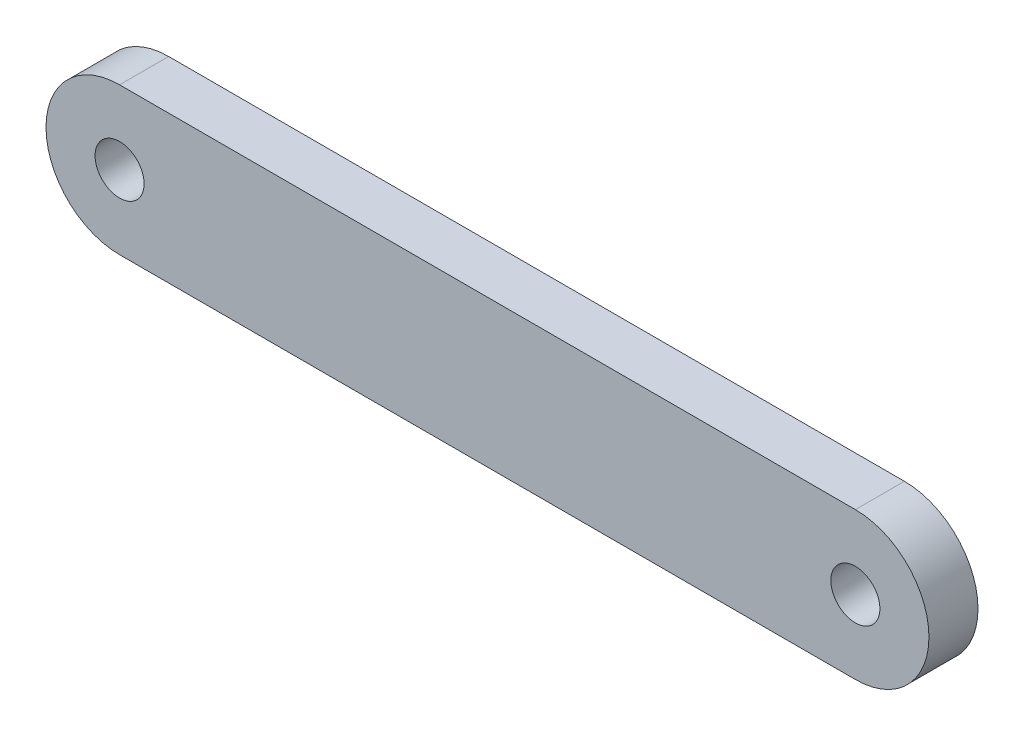
ISO-10303-21;
HEADER;
FILE_DESCRIPTION(('STEP AP214'),'2;1');
FILE_NAME('part.step','',(''),(''),'','','');
FILE_SCHEMA(('AUTOMOTIVE_DESIGN { 1 0 10303 214 1 1 1 1 }'));
ENDSEC;
DATA;
#1=APPLICATION_CONTEXT('core data for automotive mechanical design processes');
#2=APPLICATION_PROTOCOL_DEFINITION('international standard','automotive_design',2000,#1);
#3=PRODUCT_CONTEXT('',#1,'mechanical');
#4=PRODUCT('Part','Part','',(#3));
#5=PRODUCT_RELATED_PRODUCT_CATEGORY('part','',(#4));
#6=PRODUCT_DEFINITION_FORMATION('','',#4);
#7=PRODUCT_DEFINITION_CONTEXT('part definition',#1,'design');
#8=PRODUCT_DEFINITION('design','',#6,#7);
#9=PRODUCT_DEFINITION_SHAPE('','',#8);
#10=(LENGTH_UNIT() NAMED_UNIT(*) SI_UNIT(.MILLI.,.METRE.));
#11=(NAMED_UNIT(*) PLANE_ANGLE_UNIT() SI_UNIT($,.RADIAN.));
#12=(NAMED_UNIT(*) SI_UNIT($,.STERADIAN.) SOLID_ANGLE_UNIT());
#13=UNCERTAINTY_MEASURE_WITH_UNIT(LENGTH_MEASURE(1.E-05),#10,'distance_accuracy_value','');
#14=(GEOMETRIC_REPRESENTATION_CONTEXT(3) GLOBAL_UNCERTAINTY_ASSIGNED_CONTEXT((#13)) GLOBAL_UNIT_ASSIGNED_CONTEXT((#10,
#11,#12)) REPRESENTATION_CONTEXT('',''));
#15=CARTESIAN_POINT('',(0.,0.,0.));
#16=DIRECTION('',(0.,0.,1.));
#17=DIRECTION('',(1.,0.,0.));
#18=AXIS2_PLACEMENT_3D('',#15,#16,#17);
#19=CARTESIAN_POINT('',(-75.,0.,5.));
#20=DIRECTION('',(0.,0.,1.));
#21=DIRECTION('',(1.,0.,0.));
#22=AXIS2_PLACEMENT_3D('',#19,#20,#21);
#23=PLANE('',#22);
#24=CARTESIAN_POINT('',(75.,0.,5.));
#25=DIRECTION('',(0.,0.,1.));
#26=DIRECTION('',(1.,0.,0.));
#27=AXIS2_PLACEMENT_3D('',#24,#25,#26);
#28=CIRCLE('',#27,5.);
#29=CARTESIAN_POINT('',(80.,0.,5.));
#30=VERTEX_POINT('',#29);
#31=EDGE_CURVE('E100',#30,#30,#28,.T.);
#32=ORIENTED_EDGE('',*,*,#31,.F.);
#33=EDGE_LOOP('',(#32));
#34=FACE_BOUND('',#33,.T.);
#35=CARTESIAN_POINT('',(-75.,0.,5.));
#36=DIRECTION('',(0.,0.,1.));
#37=DIRECTION('',(1.,0.,0.));
#38=AXIS2_PLACEMENT_3D('',#35,#36,#37);
#39=CIRCLE('',#38,15.);
#40=CARTESIAN_POINT('',(-75.,15.,5.));
#41=VERTEX_POINT('',#40);
#42=CARTESIAN_POINT('',(-75.,-15.,5.));
#43=VERTEX_POINT('',#42);
#44=EDGE_CURVE('E85',#41,#43,#39,.T.);
#45=ORIENTED_EDGE('',*,*,#44,.T.);
#46=DIRECTION('',(1.,0.,0.));
#47=VECTOR('',#46,1.);
#48=CARTESIAN_POINT('',(-75.,-15.,5.));
#49=LINE('',#48,#47);
#50=CARTESIAN_POINT('',(75.,-15.,5.));
#51=VERTEX_POINT('',#50);
#52=EDGE_CURVE('E80',#43,#51,#49,.T.);
#53=ORIENTED_EDGE('',*,*,#52,.T.);
#54=CARTESIAN_POINT('',(75.,0.,5.));
#55=DIRECTION('',(0.,0.,1.));
#56=DIRECTION('',(1.,0.,0.));
#57=AXIS2_PLACEMENT_3D('',#54,#55,#56);
#58=CIRCLE('',#57,15.);
#59=CARTESIAN_POINT('',(75.,15.0000000000001,5.));
#60=VERTEX_POINT('',#59);
#61=EDGE_CURVE('E83',#51,#60,#58,.T.);
#62=ORIENTED_EDGE('',*,*,#61,.T.);
#63=DIRECTION('',(-1.,0.,0.));
#64=VECTOR('',#63,1.);
#65=CARTESIAN_POINT('',(-75.,15.,5.));
#66=LINE('',#65,#64);
#67=EDGE_CURVE('E50',#60,#41,#66,.T.);
#68=ORIENTED_EDGE('',*,*,#67,.T.);
#69=EDGE_LOOP('',(#45,#53,#62,#68));
#70=FACE_BOUND('',#69,.T.);
#71=CARTESIAN_POINT('',(-75.,0.,5.));
#72=DIRECTION('',(0.,0.,1.));
#73=DIRECTION('',(1.,0.,0.));
#74=AXIS2_PLACEMENT_3D('',#71,#72,#73);
#75=CIRCLE('',#74,5.);
#76=CARTESIAN_POINT('',(-70.,0.,5.));
#77=VERTEX_POINT('',#76);
#78=EDGE_CURVE('E115',#77,#77,#75,.T.);
#79=ORIENTED_EDGE('',*,*,#78,.F.);
#80=EDGE_LOOP('',(#79));
#81=FACE_BOUND('',#80,.T.);
#82=ADVANCED_FACE('F33',(#34,#70,#81),#23,.T.);
#83=CARTESIAN_POINT('',(-75.,0.,-5.));
#84=DIRECTION('',(0.,0.,1.));
#85=DIRECTION('',(1.,0.,0.));
#86=AXIS2_PLACEMENT_3D('',#83,#84,#85);
#87=PLANE('',#86);
#88=CARTESIAN_POINT('',(-75.,0.,-5.));
#89=DIRECTION('',(0.,0.,1.));
#90=DIRECTION('',(1.,0.,0.));
#91=AXIS2_PLACEMENT_3D('',#88,#89,#90);
#92=CIRCLE('',#91,15.);
#93=CARTESIAN_POINT('',(-75.,15.,-5.));
#94=VERTEX_POINT('',#93);
#95=CARTESIAN_POINT('',(-75.,-15.,-5.));
#96=VERTEX_POINT('',#95);
#97=EDGE_CURVE('E97',#94,#96,#92,.T.);
#98=ORIENTED_EDGE('',*,*,#97,.F.);
#99=DIRECTION('',(-1.,0.,0.));
#100=VECTOR('',#99,1.);
#101=CARTESIAN_POINT('',(-75.,15.,-5.));
#102=LINE('',#101,#100);
#103=CARTESIAN_POINT('',(75.,15.0000000000001,-5.));
#104=VERTEX_POINT('',#103);
#105=EDGE_CURVE('E73',#104,#94,#102,.T.);
#106=ORIENTED_EDGE('',*,*,#105,.F.);
#107=CARTESIAN_POINT('',(75.,0.,-5.));
#108=DIRECTION('',(0.,0.,1.));
#109=DIRECTION('',(1.,0.,0.));
#110=AXIS2_PLACEMENT_3D('',#107,#108,#109);
#111=CIRCLE('',#110,15.);
#112=CARTESIAN_POINT('',(75.,-15.,-5.));
#113=VERTEX_POINT('',#112);
#114=EDGE_CURVE('E67',#113,#104,#111,.T.);
#115=ORIENTED_EDGE('',*,*,#114,.F.);
#116=DIRECTION('',(1.,0.,0.));
#117=VECTOR('',#116,1.);
#118=CARTESIAN_POINT('',(-75.,-15.,-5.));
#119=LINE('',#118,#117);
#120=EDGE_CURVE('E89',#96,#113,#119,.T.);
#121=ORIENTED_EDGE('',*,*,#120,.F.);
#122=EDGE_LOOP('',(#98,#106,#115,#121));
#123=FACE_BOUND('',#122,.T.);
#124=CARTESIAN_POINT('',(75.,0.,-5.));
#125=DIRECTION('',(0.,0.,1.));
#126=DIRECTION('',(1.,0.,0.));
#127=AXIS2_PLACEMENT_3D('',#124,#125,#126);
#128=CIRCLE('',#127,5.);
#129=CARTESIAN_POINT('',(80.,0.,-5.));
#130=VERTEX_POINT('',#129);
#131=EDGE_CURVE('E112',#130,#130,#128,.T.);
#132=ORIENTED_EDGE('',*,*,#131,.T.);
#133=EDGE_LOOP('',(#132));
#134=FACE_BOUND('',#133,.T.);
#135=CARTESIAN_POINT('',(-75.,0.,-5.));
#136=DIRECTION('',(0.,0.,1.));
#137=DIRECTION('',(1.,0.,0.));
#138=AXIS2_PLACEMENT_3D('',#135,#136,#137);
#139=CIRCLE('',#138,5.);
#140=CARTESIAN_POINT('',(-70.,0.,-5.));
#141=VERTEX_POINT('',#140);
#142=EDGE_CURVE('E118',#141,#141,#139,.T.);
#143=ORIENTED_EDGE('',*,*,#142,.T.);
#144=EDGE_LOOP('',(#143));
#145=FACE_BOUND('',#144,.T.);
#146=ADVANCED_FACE('F108',(#123,#134,#145),#87,.F.);
#147=CARTESIAN_POINT('',(-75.,0.,5.));
#148=DIRECTION('',(0.,0.,-1.));
#149=DIRECTION('',(-1.,0.,0.));
#150=AXIS2_PLACEMENT_3D('',#147,#148,#149);
#151=CYLINDRICAL_SURFACE('',#150,15.);
#152=ORIENTED_EDGE('',*,*,#97,.T.);
#153=DIRECTION('',(0.,0.,-1.));
#154=VECTOR('',#153,1.);
#155=CARTESIAN_POINT('',(-75.,-15.,5.));
#156=LINE('',#155,#154);
#157=EDGE_CURVE('E11',#43,#96,#156,.T.);
#158=ORIENTED_EDGE('',*,*,#157,.F.);
#159=ORIENTED_EDGE('',*,*,#44,.F.);
#160=DIRECTION('',(0.,0.,-1.));
#161=VECTOR('',#160,1.);
#162=CARTESIAN_POINT('',(-75.,15.,5.));
#163=LINE('',#162,#161);
#164=EDGE_CURVE('E93',#41,#94,#163,.T.);
#165=ORIENTED_EDGE('',*,*,#164,.T.);
#166=EDGE_LOOP('',(#152,#158,#159,#165));
#167=FACE_BOUND('',#166,.T.);
#168=ADVANCED_FACE('F35',(#167),#151,.T.);
#169=CARTESIAN_POINT('',(-75.,-15.,5.));
#170=DIRECTION('',(0.,1.,0.));
#171=DIRECTION('',(-1.,0.,0.));
#172=AXIS2_PLACEMENT_3D('',#169,#170,#171);
#173=PLANE('',#172);
#174=ORIENTED_EDGE('',*,*,#120,.T.);
#175=DIRECTION('',(0.,0.,-1.));
#176=VECTOR('',#175,1.);
#177=CARTESIAN_POINT('',(75.,-15.,5.));
#178=LINE('',#177,#176);
#179=EDGE_CURVE('E42',#51,#113,#178,.T.);
#180=ORIENTED_EDGE('',*,*,#179,.F.);
#181=ORIENTED_EDGE('',*,*,#52,.F.);
#182=ORIENTED_EDGE('',*,*,#157,.T.);
#183=EDGE_LOOP('',(#174,#180,#181,#182));
#184=FACE_BOUND('',#183,.T.);
#185=ADVANCED_FACE('F88',(#184),#173,.F.);
#186=CARTESIAN_POINT('',(75.,0.,5.));
#187=DIRECTION('',(0.,0.,-1.));
#188=DIRECTION('',(-1.,0.,0.));
#189=AXIS2_PLACEMENT_3D('',#186,#187,#188);
#190=CYLINDRICAL_SURFACE('',#189,15.);
#191=ORIENTED_EDGE('',*,*,#114,.T.);
#192=DIRECTION('',(0.,0.,-1.));
#193=VECTOR('',#192,1.);
#194=CARTESIAN_POINT('',(75.,15.0000000000001,5.));
#195=LINE('',#194,#193);
#196=EDGE_CURVE('E90',#60,#104,#195,.T.);
#197=ORIENTED_EDGE('',*,*,#196,.F.);
#198=ORIENTED_EDGE('',*,*,#61,.F.);
#199=ORIENTED_EDGE('',*,*,#179,.T.);
#200=EDGE_LOOP('',(#191,#197,#198,#199));
#201=FACE_BOUND('',#200,.T.);
#202=ADVANCED_FACE('F91',(#201),#190,.T.);
#203=CARTESIAN_POINT('',(-75.,15.,5.));
#204=DIRECTION('',(0.,-1.,0.));
#205=DIRECTION('',(1.,0.,0.));
#206=AXIS2_PLACEMENT_3D('',#203,#204,#205);
#207=PLANE('',#206);
#208=ORIENTED_EDGE('',*,*,#105,.T.);
#209=ORIENTED_EDGE('',*,*,#164,.F.);
#210=ORIENTED_EDGE('',*,*,#67,.F.);
#211=ORIENTED_EDGE('',*,*,#196,.T.);
#212=EDGE_LOOP('',(#208,#209,#210,#211));
#213=FACE_BOUND('',#212,.T.);
#214=ADVANCED_FACE('F105',(#213),#207,.F.);
#215=CARTESIAN_POINT('',(75.,0.,5.));
#216=DIRECTION('',(0.,0.,-1.));
#217=DIRECTION('',(-1.,0.,0.));
#218=AXIS2_PLACEMENT_3D('',#215,#216,#217);
#219=CYLINDRICAL_SURFACE('',#218,5.);
#220=ORIENTED_EDGE('',*,*,#31,.T.);
#221=EDGE_LOOP('',(#220));
#222=FACE_BOUND('',#221,.T.);
#223=ORIENTED_EDGE('',*,*,#131,.F.);
#224=EDGE_LOOP('',(#223));
#225=FACE_BOUND('',#224,.T.);
#226=ADVANCED_FACE('F135',(#222,#225),#219,.F.);
#227=CARTESIAN_POINT('',(-75.,0.,5.));
#228=DIRECTION('',(0.,0.,-1.));
#229=DIRECTION('',(-1.,0.,0.));
#230=AXIS2_PLACEMENT_3D('',#227,#228,#229);
#231=CYLINDRICAL_SURFACE('',#230,5.);
#232=ORIENTED_EDGE('',*,*,#78,.T.);
#233=EDGE_LOOP('',(#232));
#234=FACE_BOUND('',#233,.T.);
#235=ORIENTED_EDGE('',*,*,#142,.F.);
#236=EDGE_LOOP('',(#235));
#237=FACE_BOUND('',#236,.T.);
#238=ADVANCED_FACE('F124',(#234,#237),#231,.F.);
#239=CLOSED_SHELL('',(#82,#146,#168,#185,#202,#214,#226,#238));
#240=MANIFOLD_SOLID_BREP('B2',#239);
#241=ADVANCED_BREP_SHAPE_REPRESENTATION('',(#18,#240),#14);
#242=SHAPE_DEFINITION_REPRESENTATION(#9,#241);
ENDSEC;
END-ISO-10303-21;
